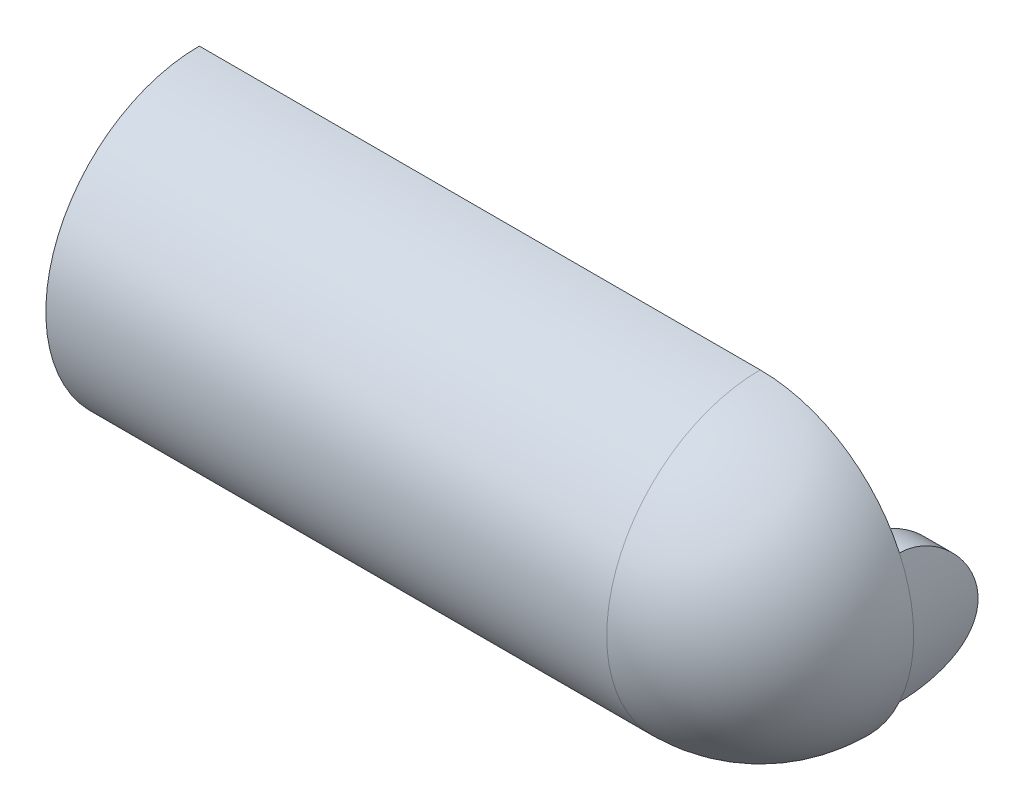
ISO-10303-21;
HEADER;
FILE_DESCRIPTION(('STEP AP214'),'2;1');
FILE_NAME('part.step','',(''),(''),'','','');
FILE_SCHEMA(('AUTOMOTIVE_DESIGN { 1 0 10303 214 1 1 1 1 }'));
ENDSEC;
DATA;
#1=APPLICATION_CONTEXT('core data for automotive mechanical design processes');
#2=APPLICATION_PROTOCOL_DEFINITION('international standard','automotive_design',2000,#1);
#3=PRODUCT_CONTEXT('',#1,'mechanical');
#4=PRODUCT('Part','Part','',(#3));
#5=PRODUCT_RELATED_PRODUCT_CATEGORY('part','',(#4));
#6=PRODUCT_DEFINITION_FORMATION('','',#4);
#7=PRODUCT_DEFINITION_CONTEXT('part definition',#1,'design');
#8=PRODUCT_DEFINITION('design','',#6,#7);
#9=PRODUCT_DEFINITION_SHAPE('','',#8);
#10=(LENGTH_UNIT() NAMED_UNIT(*) SI_UNIT(.MILLI.,.METRE.));
#11=(NAMED_UNIT(*) PLANE_ANGLE_UNIT() SI_UNIT($,.RADIAN.));
#12=(NAMED_UNIT(*) SI_UNIT($,.STERADIAN.) SOLID_ANGLE_UNIT());
#13=UNCERTAINTY_MEASURE_WITH_UNIT(LENGTH_MEASURE(1.E-05),#10,'distance_accuracy_value','');
#14=(GEOMETRIC_REPRESENTATION_CONTEXT(3) GLOBAL_UNCERTAINTY_ASSIGNED_CONTEXT((#13)) GLOBAL_UNIT_ASSIGNED_CONTEXT((#10,
#11,#12)) REPRESENTATION_CONTEXT('',''));
#15=CARTESIAN_POINT('',(0.,0.,0.));
#16=DIRECTION('',(0.,0.,1.));
#17=DIRECTION('',(1.,0.,0.));
#18=AXIS2_PLACEMENT_3D('',#15,#16,#17);
#19=CARTESIAN_POINT('',(0.,0.,40.));
#20=DIRECTION('',(0.,0.,1.));
#21=DIRECTION('',(1.,0.,0.));
#22=AXIS2_PLACEMENT_3D('',#19,#20,#21);
#23=PLANE('',#22);
#24=CARTESIAN_POINT('',(-90.,-36.,40.));
#25=DIRECTION('',(0.,0.,1.));
#26=DIRECTION('',(1.,0.,0.));
#27=AXIS2_PLACEMENT_3D('',#24,#25,#26);
#28=CIRCLE('',#27,2.);
#29=CARTESIAN_POINT('',(-88.,-36.,40.));
#30=VERTEX_POINT('',#29);
#31=EDGE_CURVE('E43',#30,#30,#28,.T.);
#32=ORIENTED_EDGE('',*,*,#31,.T.);
#33=EDGE_LOOP('',(#32));
#34=FACE_BOUND('',#33,.T.);
#35=CARTESIAN_POINT('',(-35.,-36.,40.));
#36=DIRECTION('',(0.,0.,1.));
#37=DIRECTION('',(1.,0.,0.));
#38=AXIS2_PLACEMENT_3D('',#35,#36,#37);
#39=CIRCLE('',#38,2.);
#40=CARTESIAN_POINT('',(-33.,-36.,40.));
#41=VERTEX_POINT('',#40);
#42=EDGE_CURVE('E189',#41,#41,#39,.T.);
#43=ORIENTED_EDGE('',*,*,#42,.T.);
#44=EDGE_LOOP('',(#43));
#45=FACE_BOUND('',#44,.T.);
#46=DIRECTION('',(-1.,0.,0.));
#47=VECTOR('',#46,1.);
#48=CARTESIAN_POINT('',(40.,-16.7999999999999,40.));
#49=LINE('',#48,#47);
#50=CARTESIAN_POINT('',(36.300964174523,-16.7999999999999,40.));
#51=VERTEX_POINT('',#50);
#52=CARTESIAN_POINT('',(28.4035209085072,-16.7999999999999,40.));
#53=VERTEX_POINT('',#52);
#54=EDGE_CURVE('E56',#51,#53,#49,.T.);
#55=ORIENTED_EDGE('',*,*,#54,.F.);
#56=CARTESIAN_POINT('',(0.,0.,40.));
#57=DIRECTION('',(0.,0.,-1.));
#58=DIRECTION('',(-1.,0.,0.));
#59=AXIS2_PLACEMENT_3D('',#56,#57,#58);
#60=CIRCLE('',#59,40.);
#61=CARTESIAN_POINT('',(0.,-40.,40.));
#62=VERTEX_POINT('',#61);
#63=EDGE_CURVE('E200',#51,#62,#60,.T.);
#64=ORIENTED_EDGE('',*,*,#63,.T.);
#65=DIRECTION('',(-1.,0.,0.));
#66=VECTOR('',#65,1.);
#67=CARTESIAN_POINT('',(40.,-40.,40.));
#68=LINE('',#67,#66);
#69=CARTESIAN_POINT('',(-146.2,-40.,40.));
#70=VERTEX_POINT('',#69);
#71=EDGE_CURVE('E48',#62,#70,#68,.T.);
#72=ORIENTED_EDGE('',*,*,#71,.T.);
#73=DIRECTION('',(0.,-1.,0.));
#74=VECTOR('',#73,1.);
#75=CARTESIAN_POINT('',(-146.2,0.,40.));
#76=LINE('',#75,#74);
#77=CARTESIAN_POINT('',(-146.2,-33.,40.));
#78=VERTEX_POINT('',#77);
#79=EDGE_CURVE('E117',#78,#70,#76,.T.);
#80=ORIENTED_EDGE('',*,*,#79,.F.);
#81=DIRECTION('',(1.,0.,0.));
#82=VECTOR('',#81,1.);
#83=CARTESIAN_POINT('',(0.,-33.,40.));
#84=LINE('',#83,#82);
#85=CARTESIAN_POINT('',(0.,-33.,40.));
#86=VERTEX_POINT('',#85);
#87=EDGE_CURVE('E157',#86,#78,#84,.F.);
#88=ORIENTED_EDGE('',*,*,#87,.F.);
#89=CARTESIAN_POINT('',(0.,0.,40.));
#90=DIRECTION('',(0.,0.,-1.));
#91=DIRECTION('',(-1.,0.,0.));
#92=AXIS2_PLACEMENT_3D('',#89,#90,#91);
#93=CIRCLE('',#92,33.);
#94=EDGE_CURVE('E205',#53,#86,#93,.T.);
#95=ORIENTED_EDGE('',*,*,#94,.F.);
#96=EDGE_LOOP('',(#55,#64,#72,#80,#88,#95));
#97=FACE_BOUND('',#96,.T.);
#98=ADVANCED_FACE('F39',(#34,#45,#97),#23,.F.);
#99=CARTESIAN_POINT('',(-35.,36.,40.));
#100=DIRECTION('',(0.,0.,1.));
#101=DIRECTION('',(1.,0.,0.));
#102=AXIS2_PLACEMENT_3D('',#99,#100,#101);
#103=CIRCLE('',#102,2.);
#104=CARTESIAN_POINT('',(-33.,36.,40.));
#105=VERTEX_POINT('',#104);
#106=EDGE_CURVE('E191',#105,#105,#103,.T.);
#107=ORIENTED_EDGE('',*,*,#106,.T.);
#108=EDGE_LOOP('',(#107));
#109=FACE_BOUND('',#108,.T.);
#110=CARTESIAN_POINT('',(-90.,36.,40.));
#111=DIRECTION('',(0.,0.,1.));
#112=DIRECTION('',(1.,0.,0.));
#113=AXIS2_PLACEMENT_3D('',#110,#111,#112);
#114=CIRCLE('',#113,2.);
#115=CARTESIAN_POINT('',(-88.,36.,40.));
#116=VERTEX_POINT('',#115);
#117=EDGE_CURVE('E193',#116,#116,#114,.T.);
#118=ORIENTED_EDGE('',*,*,#117,.T.);
#119=EDGE_LOOP('',(#118));
#120=FACE_BOUND('',#119,.T.);
#121=CARTESIAN_POINT('',(0.,40.,40.));
#122=VERTEX_POINT('',#121);
#123=CARTESIAN_POINT('',(36.300964174523,16.7999999999999,40.));
#124=VERTEX_POINT('',#123);
#125=EDGE_CURVE('E201',#122,#124,#60,.T.);
#126=ORIENTED_EDGE('',*,*,#125,.T.);
#127=DIRECTION('',(-1.,0.,0.));
#128=VECTOR('',#127,1.);
#129=CARTESIAN_POINT('',(40.,16.7999999999999,40.));
#130=LINE('',#129,#128);
#131=CARTESIAN_POINT('',(28.4035209085072,16.7999999999999,40.));
#132=VERTEX_POINT('',#131);
#133=EDGE_CURVE('E119',#124,#132,#130,.T.);
#134=ORIENTED_EDGE('',*,*,#133,.T.);
#135=CARTESIAN_POINT('',(0.,33.,40.));
#136=VERTEX_POINT('',#135);
#137=EDGE_CURVE('E159',#136,#132,#93,.T.);
#138=ORIENTED_EDGE('',*,*,#137,.F.);
#139=DIRECTION('',(-1.,0.,0.));
#140=VECTOR('',#139,1.);
#141=CARTESIAN_POINT('',(40.,33.,40.));
#142=LINE('',#141,#140);
#143=CARTESIAN_POINT('',(-146.2,33.,40.));
#144=VERTEX_POINT('',#143);
#145=EDGE_CURVE('E11',#136,#144,#142,.T.);
#146=ORIENTED_EDGE('',*,*,#145,.T.);
#147=DIRECTION('',(0.,-1.,0.));
#148=VECTOR('',#147,1.);
#149=CARTESIAN_POINT('',(-146.2,0.,40.));
#150=LINE('',#149,#148);
#151=CARTESIAN_POINT('',(-146.2,40.,40.));
#152=VERTEX_POINT('',#151);
#153=EDGE_CURVE('E108',#152,#144,#150,.T.);
#154=ORIENTED_EDGE('',*,*,#153,.F.);
#155=DIRECTION('',(-1.,0.,0.));
#156=VECTOR('',#155,1.);
#157=CARTESIAN_POINT('',(40.,40.,40.));
#158=LINE('',#157,#156);
#159=EDGE_CURVE('E95',#122,#152,#158,.T.);
#160=ORIENTED_EDGE('',*,*,#159,.F.);
#161=EDGE_LOOP('',(#126,#134,#138,#146,#154,#160));
#162=FACE_BOUND('',#161,.T.);
#163=ADVANCED_FACE('F41',(#109,#120,#162),#23,.F.);
#164=CARTESIAN_POINT('',(0.,0.,40.));
#165=DIRECTION('',(0.,0.,1.));
#166=DIRECTION('',(1.,0.,0.));
#167=AXIS2_PLACEMENT_3D('',#164,#165,#166);
#168=SPHERICAL_SURFACE('',#167,40.);
#169=ORIENTED_EDGE('',*,*,#125,.F.);
#170=CARTESIAN_POINT('',(0.,0.,40.));
#171=DIRECTION('',(-1.,0.,0.));
#172=DIRECTION('',(0.,0.,1.));
#173=AXIS2_PLACEMENT_3D('',#170,#171,#172);
#174=CIRCLE('',#173,40.);
#175=EDGE_CURVE('E103',#62,#122,#174,.T.);
#176=ORIENTED_EDGE('',*,*,#175,.F.);
#177=ORIENTED_EDGE('',*,*,#63,.F.);
#178=CARTESIAN_POINT('',(0.,0.,40.));
#179=DIRECTION('',(0.,0.,-1.));
#180=DIRECTION('',(-1.,0.,0.));
#181=AXIS2_PLACEMENT_3D('',#178,#179,#180);
#182=CIRCLE('',#181,40.);
#183=EDGE_CURVE('E63',#124,#51,#182,.T.);
#184=ORIENTED_EDGE('',*,*,#183,.F.);
#185=EDGE_LOOP('',(#169,#176,#177,#184));
#186=FACE_BOUND('',#185,.T.);
#187=ADVANCED_FACE('F174',(#186),#168,.T.);
#188=CARTESIAN_POINT('',(40.,0.,40.));
#189=DIRECTION('',(-1.,0.,0.));
#190=DIRECTION('',(0.,0.,1.));
#191=AXIS2_PLACEMENT_3D('',#188,#189,#190);
#192=CYLINDRICAL_SURFACE('',#191,40.);
#193=ORIENTED_EDGE('',*,*,#71,.F.);
#194=ORIENTED_EDGE('',*,*,#175,.T.);
#195=ORIENTED_EDGE('',*,*,#159,.T.);
#196=CARTESIAN_POINT('',(-146.2,0.,40.));
#197=DIRECTION('',(-1.,0.,0.));
#198=DIRECTION('',(0.,-1.,0.));
#199=AXIS2_PLACEMENT_3D('',#196,#197,#198);
#200=CIRCLE('',#199,40.);
#201=EDGE_CURVE('E100',#70,#152,#200,.T.);
#202=ORIENTED_EDGE('',*,*,#201,.F.);
#203=EDGE_LOOP('',(#193,#194,#195,#202));
#204=FACE_BOUND('',#203,.T.);
#205=ADVANCED_FACE('F98',(#204),#192,.T.);
#206=CARTESIAN_POINT('',(40.,0.,40.));
#207=DIRECTION('',(-1.,0.,0.));
#208=DIRECTION('',(0.,0.,1.));
#209=AXIS2_PLACEMENT_3D('',#206,#207,#208);
#210=CYLINDRICAL_SURFACE('',#209,33.);
#211=ORIENTED_EDGE('',*,*,#87,.T.);
#212=CARTESIAN_POINT('',(-146.2,0.,40.));
#213=DIRECTION('',(-1.,0.,0.));
#214=DIRECTION('',(0.,-1.,0.));
#215=AXIS2_PLACEMENT_3D('',#212,#213,#214);
#216=CIRCLE('',#215,33.);
#217=EDGE_CURVE('E113',#144,#78,#216,.F.);
#218=ORIENTED_EDGE('',*,*,#217,.F.);
#219=ORIENTED_EDGE('',*,*,#145,.F.);
#220=CARTESIAN_POINT('',(0.,0.,40.));
#221=DIRECTION('',(-1.,0.,0.));
#222=DIRECTION('',(0.,0.,1.));
#223=AXIS2_PLACEMENT_3D('',#220,#221,#222);
#224=CIRCLE('',#223,33.);
#225=EDGE_CURVE('E105',#86,#136,#224,.T.);
#226=ORIENTED_EDGE('',*,*,#225,.F.);
#227=EDGE_LOOP('',(#211,#218,#219,#226));
#228=FACE_BOUND('',#227,.T.);
#229=ADVANCED_FACE('F165',(#228),#210,.F.);
#230=CARTESIAN_POINT('',(0.,0.,40.));
#231=DIRECTION('',(0.,0.,1.));
#232=DIRECTION('',(1.,0.,0.));
#233=AXIS2_PLACEMENT_3D('',#230,#231,#232);
#234=SPHERICAL_SURFACE('',#233,33.);
#235=ORIENTED_EDGE('',*,*,#137,.T.);
#236=CARTESIAN_POINT('',(0.,0.,40.));
#237=DIRECTION('',(0.,0.,-1.));
#238=DIRECTION('',(-1.,0.,0.));
#239=AXIS2_PLACEMENT_3D('',#236,#237,#238);
#240=CIRCLE('',#239,33.);
#241=EDGE_CURVE('E158',#132,#53,#240,.T.);
#242=ORIENTED_EDGE('',*,*,#241,.T.);
#243=ORIENTED_EDGE('',*,*,#94,.T.);
#244=ORIENTED_EDGE('',*,*,#225,.T.);
#245=EDGE_LOOP('',(#235,#242,#243,#244));
#246=FACE_BOUND('',#245,.T.);
#247=ADVANCED_FACE('F168',(#246),#234,.F.);
#248=CARTESIAN_POINT('',(0.,0.,80.));
#249=DIRECTION('',(0.,0.,-1.));
#250=DIRECTION('',(-1.,0.,0.));
#251=AXIS2_PLACEMENT_3D('',#248,#249,#250);
#252=CYLINDRICAL_SURFACE('',#251,40.);
#253=ORIENTED_EDGE('',*,*,#183,.T.);
#254=CARTESIAN_POINT('',(36.300964174523,-16.7999999999999,40.));
#255=CARTESIAN_POINT('',(36.3009604118072,-16.8000010750221,39.7750876995111));
#256=CARTESIAN_POINT('',(36.3030552509839,-16.7954825342421,39.55020560437));
#257=CARTESIAN_POINT('',(36.3114029739977,-16.7774300099027,39.1008899131796));
#258=CARTESIAN_POINT('',(36.3176556882656,-16.7638963940022,38.8764562992144));
#259=CARTESIAN_POINT('',(36.3425814636107,-16.7098312790472,38.2046712409195));
#260=CARTESIAN_POINT('',(36.3674222564318,-16.6558354458748,37.7585449624995));
#261=CARTESIAN_POINT('',(36.4325607309919,-16.5128618098385,36.8751224761959));
#262=CARTESIAN_POINT('',(36.4727921705168,-16.4240338858014,36.4377967659705));
#263=CARTESIAN_POINT('',(36.5673845673427,-16.2123351272067,35.5729969125453));
#264=CARTESIAN_POINT('',(36.6217465138487,-16.0894619092711,35.1455234613339));
#265=CARTESIAN_POINT('',(36.7427874521481,-15.8110891220389,34.3038915188794));
#266=CARTESIAN_POINT('',(36.8094476612096,-15.6556392574348,33.8897138388969));
#267=CARTESIAN_POINT('',(36.953181998111,-15.3132881658787,33.076271649571));
#268=CARTESIAN_POINT('',(37.030260105758,-15.1263749126695,32.6770129142772));
#269=CARTESIAN_POINT('',(37.1926974992686,-14.7224536129231,31.8954974738009));
#270=CARTESIAN_POINT('',(37.2780615339163,-14.5054282777575,31.5132507036269));
#271=CARTESIAN_POINT('',(37.4548164566535,-14.0427231028209,30.7677467057199));
#272=CARTESIAN_POINT('',(37.5462101226694,-13.7970300148262,30.4044983709265));
#273=CARTESIAN_POINT('',(37.737998133578,-13.2637946106032,29.6788656717074));
#274=CARTESIAN_POINT('',(37.8386088755806,-12.9746680892075,29.3177018051427));
#275=CARTESIAN_POINT('',(38.0412296974377,-12.3679856423973,28.6207954839555));
#276=CARTESIAN_POINT('',(38.1432392171304,-12.0504408313066,28.2850431849355));
#277=CARTESIAN_POINT('',(38.346118027879,-11.3883780011628,27.6404522136356));
#278=CARTESIAN_POINT('',(38.4469865890937,-11.0438437234851,27.331630004601));
#279=CARTESIAN_POINT('',(38.6449105806249,-10.3299577821333,26.743081005186));
#280=CARTESIAN_POINT('',(38.741967411503,-9.96061537161285,26.4633434646602));
#281=CARTESIAN_POINT('',(38.9340333635739,-9.18198647278796,25.9228697661649));
#282=CARTESIAN_POINT('',(39.0287580914991,-8.77165315724662,25.6635375283913));
#283=CARTESIAN_POINT('',(39.2087384601004,-7.92847059490299,25.1805734153227));
#284=CARTESIAN_POINT('',(39.2939937394655,-7.49562048988715,24.9569429021007));
#285=CARTESIAN_POINT('',(39.4525538998511,-6.6104503640752,24.5475038957472));
#286=CARTESIAN_POINT('',(39.5258630240673,-6.15813732885927,24.3616819673994));
#287=CARTESIAN_POINT('',(39.6583932790667,-5.23719301874111,24.0296729133332));
#288=CARTESIAN_POINT('',(39.7176154147475,-4.76856291055553,23.8834829603575));
#289=CARTESIAN_POINT('',(39.8174632833972,-3.84374739350494,23.6390051043904));
#290=CARTESIAN_POINT('',(39.8589054482748,-3.38821030143468,23.5385964645617));
#291=CARTESIAN_POINT('',(39.9263701879677,-2.46924577198883,23.3759050753889));
#292=CARTESIAN_POINT('',(39.9523932587227,-2.00581858888332,23.3136210998014));
#293=CARTESIAN_POINT('',(39.9882664697504,-1.07491545627926,23.2279109470367));
#294=CARTESIAN_POINT('',(39.9981219903633,-0.607440905772363,23.2044718427897));
#295=CARTESIAN_POINT('',(40.001389552908,0.327882610281673,23.1966911660097));
#296=CARTESIAN_POINT('',(39.9948022440848,0.795731560316474,23.212348049772));
#297=CARTESIAN_POINT('',(39.9662926230558,1.69908940280556,23.2803885492417));
#298=CARTESIAN_POINT('',(39.9453449394773,2.13480728945374,23.3304384254673));
#299=CARTESIAN_POINT('',(39.8896882702717,3.00011942859994,23.4642528483444));
#300=CARTESIAN_POINT('',(39.8549799628556,3.42971398181386,23.5480157334079));
#301=CARTESIAN_POINT('',(39.7726659913885,4.27989040817916,23.7484370558606));
#302=CARTESIAN_POINT('',(39.7250601056538,4.70047212628383,23.8650960586696));
#303=CARTESIAN_POINT('',(39.6181096800004,5.52994371896404,24.1302387871026));
#304=CARTESIAN_POINT('',(39.5587647892306,5.9388332436694,24.2787234639318));
#305=CARTESIAN_POINT('',(39.4287599398431,6.74860053778461,24.6087538498616));
#306=CARTESIAN_POINT('',(39.3579414491899,7.1492615122694,24.7907685432955));
#307=CARTESIAN_POINT('',(39.2073376133822,7.93373970833204,25.1848567891202));
#308=CARTESIAN_POINT('',(39.1275522444794,8.31755688529625,25.3969304211211));
#309=CARTESIAN_POINT('',(38.9608523121281,9.06637460235908,25.8496536767925));
#310=CARTESIAN_POINT('',(38.8739368982545,9.43137288938372,26.0903067107643));
#311=CARTESIAN_POINT('',(38.6949292549644,10.1408268782855,26.5987248644996));
#312=CARTESIAN_POINT('',(38.6028350272108,10.4852745432077,26.8665004823703));
#313=CARTESIAN_POINT('',(38.408899109876,11.1755983094102,27.447558826689));
#314=CARTESIAN_POINT('',(38.3068304398916,11.5198275181149,27.7627245639945));
#315=CARTESIAN_POINT('',(38.1018186757084,12.1807703718187,28.4204398010824));
#316=CARTESIAN_POINT('',(37.9988755535539,12.4974831334731,28.7629901793008));
#317=CARTESIAN_POINT('',(37.7947964567804,13.101721604628,29.4737215394995));
#318=CARTESIAN_POINT('',(37.6936613068873,13.3892342606934,29.8419138613962));
#319=CARTESIAN_POINT('',(37.4960073740983,13.933169067975,30.601852443152));
#320=CARTESIAN_POINT('',(37.3994892793206,14.189586593512,30.9936021944556));
#321=CARTESIAN_POINT('',(37.2106464093404,14.6778298852058,31.8124300389603));
#322=CARTESIAN_POINT('',(37.1185829377703,14.9084952062334,32.2402620082778));
#323=CARTESIAN_POINT('',(36.9454479846193,15.3325253377157,33.1159448864615));
#324=CARTESIAN_POINT('',(36.8643717068931,15.5259064392157,33.5637869462342));
#325=CARTESIAN_POINT('',(36.7160996670301,15.873364767502,34.4760387964088));
#326=CARTESIAN_POINT('',(36.6488856519379,16.02749374267,34.9404258436323));
#327=CARTESIAN_POINT('',(36.5307372675919,16.2949874342898,35.8825806096009));
#328=CARTESIAN_POINT('',(36.4797956382418,16.4083703328636,36.3603422573532));
#329=CARTESIAN_POINT('',(36.3930454670625,16.5999484932426,37.3617439046233));
#330=CARTESIAN_POINT('',(36.3586522029796,16.6748812288313,37.8861444165888));
#331=CARTESIAN_POINT('',(36.3241181136748,16.7498981982956,38.6767111470393));
#332=CARTESIAN_POINT('',(36.315449393303,16.768673494008,38.9408789882179));
#333=CARTESIAN_POINT('',(36.303868019237,16.793727172386,39.4700138710551));
#334=CARTESIAN_POINT('',(36.3009571422884,16.8000016975887,39.7349811341448));
#335=CARTESIAN_POINT('',(36.300964174523,16.7999999999999,40.));
#336=B_SPLINE_CURVE_WITH_KNOTS('',3,(#254,#255,#256,#257,#258,#259,#260,#261,#262,#263,#264,
#265,#266,#267,#268,#269,#270,#271,#272,#273,#274,#275,#276,#277,#278,#279,#280,#281,#282,#283,
#284,#285,#286,#287,#288,#289,#290,#291,#292,#293,#294,#295,#296,#297,#298,#299,#300,#301,#302,
#303,#304,#305,#306,#307,#308,#309,#310,#311,#312,#313,#314,#315,#316,#317,#318,#319,#320,#321,
#322,#323,#324,#325,#326,#327,#328,#329,#330,#331,#332,#333,#334,#335),.UNSPECIFIED.,.F.,.F.,(4,
2,2,2,2,2,2,2,2,2,2,2,2,2,2,2,2,2,2,2,2,2,2,2,2,2,2,2,2,2,2,2,2,2,2,2,2,2,2,2,4),(0.,
0.674621888882387,1.34921626656437,2.69753624257895,4.04011710270129,5.38279197542413,
6.72343295008924,8.06458752667324,9.4065153282981,10.7490657494433,12.1678570364831,
13.5860958425844,15.0051956736159,16.4237691045638,17.9056114207149,19.387510257813,
20.8688815814482,22.3501471995092,23.753244749532,25.1562971678896,26.5588825747534,
27.9614126014206,29.277112826616,30.5927482138067,31.9084062155749,33.2241035451945,
34.5598346236585,35.8955692398193,37.2314634059689,38.5678766356797,39.99951095041,
41.4311912071033,42.8635086819922,44.2960389662409,45.7782226563366,47.2597572429351,
48.7393284046384,50.2182385150635,51.8076607430338,52.6022799293338,53.3971442796754),.UNSPECIFIED.);
#337=EDGE_CURVE('E128',#51,#124,#336,.T.);
#338=ORIENTED_EDGE('',*,*,#337,.T.);
#339=EDGE_LOOP('',(#253,#338));
#340=FACE_BOUND('',#339,.T.);
#341=ADVANCED_FACE('F138',(#340),#252,.T.);
#342=CARTESIAN_POINT('',(0.,0.,80.));
#343=DIRECTION('',(0.,0.,-1.));
#344=DIRECTION('',(-1.,0.,0.));
#345=AXIS2_PLACEMENT_3D('',#342,#343,#344);
#346=CYLINDRICAL_SURFACE('',#345,33.);
#347=CARTESIAN_POINT('',(28.4035209085072,-16.7999999999999,40.));
#348=CARTESIAN_POINT('',(28.4035156885725,-16.8000017048056,39.780628934719));
#349=CARTESIAN_POINT('',(28.4060634102703,-16.7957022894808,39.5612890807998));
#350=CARTESIAN_POINT('',(28.4162113273405,-16.7785302952616,39.1230717796376));
#351=CARTESIAN_POINT('',(28.4238112991943,-16.7656580956392,38.9041943123678));
#352=CARTESIAN_POINT('',(28.4540921249759,-16.7142554042536,38.249209122198));
#353=CARTESIAN_POINT('',(28.484254074438,-16.6629387086037,37.814362814625));
#354=CARTESIAN_POINT('',(28.5631540377006,-16.5273193301579,36.9543107105791));
#355=CARTESIAN_POINT('',(28.6117810839003,-16.443213616824,36.5290630962624));
#356=CARTESIAN_POINT('',(28.7258814679429,-16.2430595431089,35.68842144192));
#357=CARTESIAN_POINT('',(28.7913568451355,-16.1270073157501,35.2730286013848));
#358=CARTESIAN_POINT('',(28.9367942518123,-15.8645629990735,34.4556798728539));
#359=CARTESIAN_POINT('',(29.0167224451664,-15.7182416612448,34.0536951444911));
#360=CARTESIAN_POINT('',(29.1887218964292,-15.3964855431689,33.2642801356627));
#361=CARTESIAN_POINT('',(29.2807929841909,-15.2210511708469,32.8768496513597));
#362=CARTESIAN_POINT('',(29.4746392832663,-14.8422017983179,32.1177905971378));
#363=CARTESIAN_POINT('',(29.5764273955463,-14.6387494365035,31.7461840092381));
#364=CARTESIAN_POINT('',(29.787030621524,-14.2053115165041,31.0207040321844));
#365=CARTESIAN_POINT('',(29.895848318315,-13.9753161801325,30.6668372475123));
#366=CARTESIAN_POINT('',(30.1273271359971,-13.4695178852094,29.9490878855668));
#367=CARTESIAN_POINT('',(30.250379551041,-13.19148417546,29.5869018941775));
#368=CARTESIAN_POINT('',(30.4984871968544,-12.6072597639415,28.8867233262338));
#369=CARTESIAN_POINT('',(30.6235425326086,-12.301067582209,28.5487320229751));
#370=CARTESIAN_POINT('',(30.8726171551828,-11.6618692924651,27.8983985899104));
#371=CARTESIAN_POINT('',(30.9966359724373,-11.3288516892221,27.5860675730993));
#372=CARTESIAN_POINT('',(31.2405578586259,-10.6377526011529,26.9889782288929));
#373=CARTESIAN_POINT('',(31.3604622901706,-10.2796795360103,26.7042107149448));
#374=CARTESIAN_POINT('',(31.6016104765935,-9.51370681239055,26.144676796103));
#375=CARTESIAN_POINT('',(31.7223449850064,-9.10407450563338,25.8720556620477));
#376=CARTESIAN_POINT('',(31.9525055895334,-8.26006682953855,25.3625728699686));
#377=CARTESIAN_POINT('',(32.0619310042086,-7.82568997164069,25.1257133663959));
#378=CARTESIAN_POINT('',(32.2662718660793,-6.93514725272818,24.6902232139649));
#379=CARTESIAN_POINT('',(32.3611944471735,-6.47899225018973,24.4915737571701));
#380=CARTESIAN_POINT('',(32.5337351126813,-5.54798232552865,24.1346811273374));
#381=CARTESIAN_POINT('',(32.6113551156702,-5.0731294835705,23.9764334741116));
#382=CARTESIAN_POINT('',(32.7418909146221,-4.1439471081994,23.7124717415717));
#383=CARTESIAN_POINT('',(32.7962006125803,-3.69066501761686,23.6037569181507));
#384=CARTESIAN_POINT('',(32.8863478971574,-2.77484511477608,23.4241764385191));
#385=CARTESIAN_POINT('',(32.9221863107098,-2.31230771782822,23.3533090879249));
#386=CARTESIAN_POINT('',(32.9743350045445,-1.38207704017128,23.2504108595958));
#387=CARTESIAN_POINT('',(32.9906553386954,-0.914386539263981,23.2183599871745));
#388=CARTESIAN_POINT('',(33.0033153860264,0.0222946206219735,23.1934847789671));
#389=CARTESIAN_POINT('',(32.9996563810494,0.491285194260406,23.2006579266296));
#390=CARTESIAN_POINT('',(32.9737036975264,1.38422016332463,23.2517005443966));
#391=CARTESIAN_POINT('',(32.9531206002083,1.80841207205189,23.2922017163561));
#392=CARTESIAN_POINT('',(32.8960248231162,2.65141382386441,23.40509639654));
#393=CARTESIAN_POINT('',(32.8595133074387,3.07022405795635,23.477487574151));
#394=CARTESIAN_POINT('',(32.7714323782225,3.8996373792321,23.6533622761015));
#395=CARTESIAN_POINT('',(32.7198627551501,4.31024035212688,23.7568462330977));
#396=CARTESIAN_POINT('',(32.6028604854214,5.12065718934655,23.9938410368067));
#397=CARTESIAN_POINT('',(32.5374273335425,5.52047065987553,24.1273529778272));
#398=CARTESIAN_POINT('',(32.3932041873686,6.31224327620165,24.4251206872895));
#399=CARTESIAN_POINT('',(32.3142477009838,6.70402656642767,24.5897627162051));
#400=CARTESIAN_POINT('',(32.1453411371016,7.47205917065556,24.9471679509961));
#401=CARTESIAN_POINT('',(32.0553910765204,7.84830850855895,25.1399311136004));
#402=CARTESIAN_POINT('',(31.8663796946072,8.58358796438306,25.5521727094676));
#403=CARTESIAN_POINT('',(31.7673161587436,8.94261386467181,25.771657640207));
#404=CARTESIAN_POINT('',(31.5621227858126,9.64184639050398,26.2358819993656));
#405=CARTESIAN_POINT('',(31.4559922355019,9.9820511101437,26.4806239782444));
#406=CARTESIAN_POINT('',(31.2282645313194,10.6743059196679,27.0188749489845));
#407=CARTESIAN_POINT('',(31.1061655331152,11.0243057813588,27.3148115217991));
#408=CARTESIAN_POINT('',(30.8589632403324,11.6984320839187,27.9336797583329));
#409=CARTESIAN_POINT('',(30.7338597599242,12.0225569190071,28.2566130949045));
#410=CARTESIAN_POINT('',(30.4835815022588,12.6437132776633,28.9281482529751));
#411=CARTESIAN_POINT('',(30.3584067678251,12.9407191656633,29.2767738102552));
#412=CARTESIAN_POINT('',(30.1112793078238,13.5057752317927,29.9978086044438));
#413=CARTESIAN_POINT('',(29.9893265019613,13.7738261320368,30.3702172478519));
#414=CARTESIAN_POINT('',(29.7437814068723,14.296731153839,31.1634674949854));
#415=CARTESIAN_POINT('',(29.6206483092418,14.5494259756852,31.585879447703));
#416=CARTESIAN_POINT('',(29.3858801171717,15.0179479874959,32.4538449620538));
#417=CARTESIAN_POINT('',(29.2742465845937,15.2337701720631,32.899401654857));
#418=CARTESIAN_POINT('',(29.0668290358806,15.6258943679293,33.8099585701645));
#419=CARTESIAN_POINT('',(28.9710109390603,15.8022816563643,34.2749142057979));
#420=CARTESIAN_POINT('',(28.7988630944512,16.1138843747358,35.2218317237663));
#421=CARTESIAN_POINT('',(28.7225249535389,16.2491175411685,35.7037861797724));
#422=CARTESIAN_POINT('',(28.6164568317142,16.4348778278218,36.5019890415181));
#423=CARTESIAN_POINT('',(28.579890715989,16.498297457326,36.8143959532272));
#424=CARTESIAN_POINT('',(28.5166491163298,16.6073688128279,37.4432299005816));
#425=CARTESIAN_POINT('',(28.4899708852807,16.6530254740217,37.7596557943416));
#426=CARTESIAN_POINT('',(28.4470063180644,16.7263188480705,38.3959492135293));
#427=CARTESIAN_POINT('',(28.4307414009106,16.7539184220676,38.7158224652396));
#428=CARTESIAN_POINT('',(28.4089765187453,16.7907751471374,39.3571244595917));
#429=CARTESIAN_POINT('',(28.4034811788845,16.800024417428,39.6785538111438));
#430=CARTESIAN_POINT('',(28.4035209085071,16.7999999999999,40.));
#431=B_SPLINE_CURVE_WITH_KNOTS('',3,(#347,#348,#349,#350,#351,#352,#353,#354,#355,#356,#357,
#358,#359,#360,#361,#362,#363,#364,#365,#366,#367,#368,#369,#370,#371,#372,#373,#374,#375,#376,
#377,#378,#379,#380,#381,#382,#383,#384,#385,#386,#387,#388,#389,#390,#391,#392,#393,#394,#395,
#396,#397,#398,#399,#400,#401,#402,#403,#404,#405,#406,#407,#408,#409,#410,#411,#412,#413,#414,
#415,#416,#417,#418,#419,#420,#421,#422,#423,#424,#425,#426,#427,#428,#429,#430),.UNSPECIFIED.,
.F.,.F.,(4,2,2,2,2,2,2,2,2,2,2,2,2,2,2,2,2,2,2,2,2,2,2,2,2,2,2,2,2,2,2,2,2,2,2,2,2,2,2,2,2,4),
(0.,0.657994657889079,1.31596020710208,2.63073822377278,3.93773690506571,5.24489386211454,
6.54902929082868,7.85314644783851,9.1590197771104,10.4653757229947,11.8825434340119,
13.299785671676,14.7176384902804,16.1350171182093,17.6530206094851,19.1711155160683,
20.6884612555217,22.2056386621568,23.611592463271,25.0174833163289,26.4226496750311,
27.8277258815303,29.1060668459013,30.384314400935,31.6625797436373,32.9408916776198,
34.2362514496099,35.531609228403,36.8272826086771,38.1230869544619,39.5445422693579,
40.9660857300024,42.388959358299,43.8117974930407,45.3320304338521,46.8524695799848,
48.3695883030745,49.8860522532897,50.8480647058297,51.8098096852508,52.7735265636606,
53.7376572335915),.UNSPECIFIED.);
#432=EDGE_CURVE('E150',#53,#132,#431,.T.);
#433=ORIENTED_EDGE('',*,*,#432,.F.);
#434=ORIENTED_EDGE('',*,*,#241,.F.);
#435=EDGE_LOOP('',(#433,#434));
#436=FACE_BOUND('',#435,.T.);
#437=ADVANCED_FACE('F145',(#436),#346,.F.);
#438=CARTESIAN_POINT('',(40.,0.,40.));
#439=DIRECTION('',(-1.,0.,0.));
#440=DIRECTION('',(0.,0.,1.));
#441=AXIS2_PLACEMENT_3D('',#438,#439,#440);
#442=CYLINDRICAL_SURFACE('',#441,16.7999999999999);
#443=ORIENTED_EDGE('',*,*,#54,.T.);
#444=ORIENTED_EDGE('',*,*,#432,.T.);
#445=ORIENTED_EDGE('',*,*,#133,.F.);
#446=ORIENTED_EDGE('',*,*,#337,.F.);
#447=EDGE_LOOP('',(#443,#444,#445,#446));
#448=FACE_BOUND('',#447,.T.);
#449=ADVANCED_FACE('F141',(#448),#442,.T.);
#450=CARTESIAN_POINT('',(-146.2,10.5,40.));
#451=DIRECTION('',(-1.,0.,0.));
#452=DIRECTION('',(0.,-1.,0.));
#453=AXIS2_PLACEMENT_3D('',#450,#451,#452);
#454=PLANE('',#453);
#455=ORIENTED_EDGE('',*,*,#153,.T.);
#456=ORIENTED_EDGE('',*,*,#217,.T.);
#457=ORIENTED_EDGE('',*,*,#79,.T.);
#458=ORIENTED_EDGE('',*,*,#201,.T.);
#459=EDGE_LOOP('',(#455,#456,#457,#458));
#460=FACE_BOUND('',#459,.T.);
#461=ADVANCED_FACE('F115',(#460),#454,.T.);
#462=CARTESIAN_POINT('',(-90.,36.,45.));
#463=DIRECTION('',(0.,0.,-1.));
#464=DIRECTION('',(-1.,0.,0.));
#465=AXIS2_PLACEMENT_3D('',#462,#463,#464);
#466=CYLINDRICAL_SURFACE('',#465,2.);
#467=CARTESIAN_POINT('',(-90.,36.,45.));
#468=DIRECTION('',(0.,0.,-1.));
#469=DIRECTION('',(-1.,0.,0.));
#470=AXIS2_PLACEMENT_3D('',#467,#468,#469);
#471=CIRCLE('',#470,2.);
#472=CARTESIAN_POINT('',(-92.,36.,45.));
#473=VERTEX_POINT('',#472);
#474=EDGE_CURVE('E387',#473,#473,#471,.T.);
#475=ORIENTED_EDGE('',*,*,#474,.F.);
#476=EDGE_LOOP('',(#475));
#477=FACE_BOUND('',#476,.T.);
#478=ORIENTED_EDGE('',*,*,#117,.F.);
#479=EDGE_LOOP('',(#478));
#480=FACE_BOUND('',#479,.T.);
#481=ADVANCED_FACE('F236',(#477,#480),#466,.F.);
#482=CARTESIAN_POINT('',(-90.,36.,45.));
#483=DIRECTION('',(0.,0.,-1.));
#484=DIRECTION('',(-1.,0.,0.));
#485=AXIS2_PLACEMENT_3D('',#482,#483,#484);
#486=PLANE('',#485);
#487=ORIENTED_EDGE('',*,*,#474,.T.);
#488=EDGE_LOOP('',(#487));
#489=FACE_BOUND('',#488,.T.);
#490=ADVANCED_FACE('F243',(#489),#486,.T.);
#491=CARTESIAN_POINT('',(-35.,36.,45.));
#492=DIRECTION('',(0.,0.,-1.));
#493=DIRECTION('',(-1.,0.,0.));
#494=AXIS2_PLACEMENT_3D('',#491,#492,#493);
#495=CYLINDRICAL_SURFACE('',#494,2.);
#496=CARTESIAN_POINT('',(-35.,36.,45.));
#497=DIRECTION('',(0.,0.,-1.));
#498=DIRECTION('',(-1.,0.,0.));
#499=AXIS2_PLACEMENT_3D('',#496,#497,#498);
#500=CIRCLE('',#499,2.);
#501=CARTESIAN_POINT('',(-37.,36.,45.));
#502=VERTEX_POINT('',#501);
#503=EDGE_CURVE('E198',#502,#502,#500,.T.);
#504=ORIENTED_EDGE('',*,*,#503,.F.);
#505=EDGE_LOOP('',(#504));
#506=FACE_BOUND('',#505,.T.);
#507=ORIENTED_EDGE('',*,*,#106,.F.);
#508=EDGE_LOOP('',(#507));
#509=FACE_BOUND('',#508,.T.);
#510=ADVANCED_FACE('F252',(#506,#509),#495,.F.);
#511=CARTESIAN_POINT('',(-35.,36.,45.));
#512=DIRECTION('',(0.,0.,-1.));
#513=DIRECTION('',(-1.,0.,0.));
#514=AXIS2_PLACEMENT_3D('',#511,#512,#513);
#515=PLANE('',#514);
#516=ORIENTED_EDGE('',*,*,#503,.T.);
#517=EDGE_LOOP('',(#516));
#518=FACE_BOUND('',#517,.T.);
#519=ADVANCED_FACE('F261',(#518),#515,.T.);
#520=CARTESIAN_POINT('',(-35.,-36.,45.));
#521=DIRECTION('',(0.,0.,-1.));
#522=DIRECTION('',(-1.,0.,0.));
#523=AXIS2_PLACEMENT_3D('',#520,#521,#522);
#524=CYLINDRICAL_SURFACE('',#523,2.);
#525=CARTESIAN_POINT('',(-35.,-36.,45.));
#526=DIRECTION('',(0.,0.,-1.));
#527=DIRECTION('',(-1.,0.,0.));
#528=AXIS2_PLACEMENT_3D('',#525,#526,#527);
#529=CIRCLE('',#528,2.);
#530=CARTESIAN_POINT('',(-37.,-36.,45.));
#531=VERTEX_POINT('',#530);
#532=EDGE_CURVE('E123',#531,#531,#529,.T.);
#533=ORIENTED_EDGE('',*,*,#532,.F.);
#534=EDGE_LOOP('',(#533));
#535=FACE_BOUND('',#534,.T.);
#536=ORIENTED_EDGE('',*,*,#42,.F.);
#537=EDGE_LOOP('',(#536));
#538=FACE_BOUND('',#537,.T.);
#539=ADVANCED_FACE('F270',(#535,#538),#524,.F.);
#540=CARTESIAN_POINT('',(-35.,-36.,45.));
#541=DIRECTION('',(0.,0.,-1.));
#542=DIRECTION('',(-1.,0.,0.));
#543=AXIS2_PLACEMENT_3D('',#540,#541,#542);
#544=PLANE('',#543);
#545=ORIENTED_EDGE('',*,*,#532,.T.);
#546=EDGE_LOOP('',(#545));
#547=FACE_BOUND('',#546,.T.);
#548=ADVANCED_FACE('F279',(#547),#544,.T.);
#549=CARTESIAN_POINT('',(-90.,-36.,45.));
#550=DIRECTION('',(0.,0.,-1.));
#551=DIRECTION('',(-1.,0.,0.));
#552=AXIS2_PLACEMENT_3D('',#549,#550,#551);
#553=CYLINDRICAL_SURFACE('',#552,2.);
#554=CARTESIAN_POINT('',(-90.,-36.,45.));
#555=DIRECTION('',(0.,0.,-1.));
#556=DIRECTION('',(-1.,0.,0.));
#557=AXIS2_PLACEMENT_3D('',#554,#555,#556);
#558=CIRCLE('',#557,2.);
#559=CARTESIAN_POINT('',(-92.,-36.,45.));
#560=VERTEX_POINT('',#559);
#561=EDGE_CURVE('E386',#560,#560,#558,.T.);
#562=ORIENTED_EDGE('',*,*,#561,.F.);
#563=EDGE_LOOP('',(#562));
#564=FACE_BOUND('',#563,.T.);
#565=ORIENTED_EDGE('',*,*,#31,.F.);
#566=EDGE_LOOP('',(#565));
#567=FACE_BOUND('',#566,.T.);
#568=ADVANCED_FACE('F287',(#564,#567),#553,.F.);
#569=CARTESIAN_POINT('',(-90.,-36.,45.));
#570=DIRECTION('',(0.,0.,-1.));
#571=DIRECTION('',(-1.,0.,0.));
#572=AXIS2_PLACEMENT_3D('',#569,#570,#571);
#573=PLANE('',#572);
#574=ORIENTED_EDGE('',*,*,#561,.T.);
#575=EDGE_LOOP('',(#574));
#576=FACE_BOUND('',#575,.T.);
#577=ADVANCED_FACE('F296',(#576),#573,.T.);
#578=CLOSED_SHELL('',(#98,#163,#187,#205,#229,#247,#341,#437,#449,#461,#481,#490,#510,#519,#539,
#548,#568,#577));
#579=MANIFOLD_SOLID_BREP('B2',#578);
#580=ADVANCED_BREP_SHAPE_REPRESENTATION('',(#18,#579),#14);
#581=SHAPE_DEFINITION_REPRESENTATION(#9,#580);
ENDSEC;
END-ISO-10303-21;
